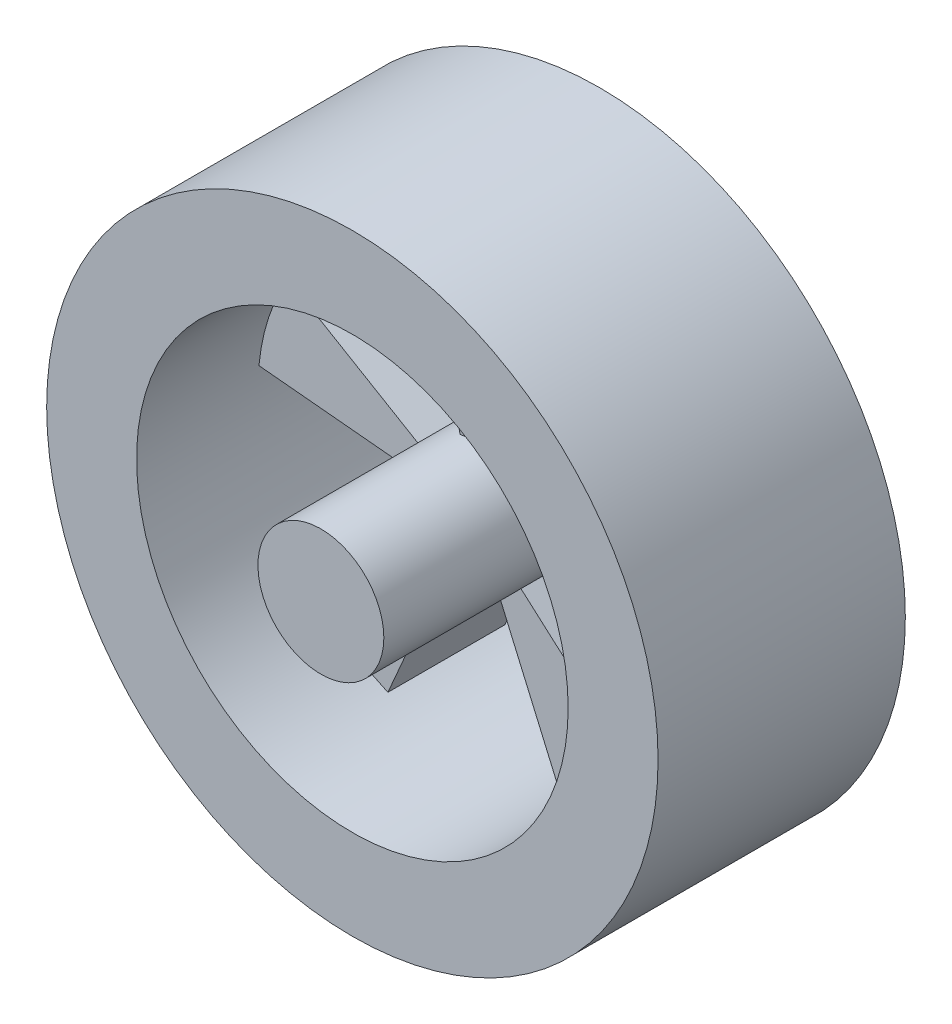
ISO-10303-21;
HEADER;
FILE_DESCRIPTION(('STEP AP214'),'2;1');
FILE_NAME('part.step','',(''),(''),'','','');
FILE_SCHEMA(('AUTOMOTIVE_DESIGN { 1 0 10303 214 1 1 1 1 }'));
ENDSEC;
DATA;
#1=APPLICATION_CONTEXT('core data for automotive mechanical design processes');
#2=APPLICATION_PROTOCOL_DEFINITION('international standard','automotive_design',2000,#1);
#3=PRODUCT_CONTEXT('',#1,'mechanical');
#4=PRODUCT('Part','Part','',(#3));
#5=PRODUCT_RELATED_PRODUCT_CATEGORY('part','',(#4));
#6=PRODUCT_DEFINITION_FORMATION('','',#4);
#7=PRODUCT_DEFINITION_CONTEXT('part definition',#1,'design');
#8=PRODUCT_DEFINITION('design','',#6,#7);
#9=PRODUCT_DEFINITION_SHAPE('','',#8);
#10=(LENGTH_UNIT() NAMED_UNIT(*) SI_UNIT(.MILLI.,.METRE.));
#11=(NAMED_UNIT(*) PLANE_ANGLE_UNIT() SI_UNIT($,.RADIAN.));
#12=(NAMED_UNIT(*) SI_UNIT($,.STERADIAN.) SOLID_ANGLE_UNIT());
#13=UNCERTAINTY_MEASURE_WITH_UNIT(LENGTH_MEASURE(1.E-05),#10,'distance_accuracy_value','');
#14=(GEOMETRIC_REPRESENTATION_CONTEXT(3) GLOBAL_UNCERTAINTY_ASSIGNED_CONTEXT((#13)) GLOBAL_UNIT_ASSIGNED_CONTEXT((#10,
#11,#12)) REPRESENTATION_CONTEXT('',''));
#15=CARTESIAN_POINT('',(0.,0.,0.));
#16=DIRECTION('',(0.,0.,1.));
#17=DIRECTION('',(1.,0.,0.));
#18=AXIS2_PLACEMENT_3D('',#15,#16,#17);
#19=CARTESIAN_POINT('',(0.,0.,30.));
#20=DIRECTION('',(0.,0.,-1.));
#21=DIRECTION('',(-1.,0.,0.));
#22=AXIS2_PLACEMENT_3D('',#19,#20,#21);
#23=CYLINDRICAL_SURFACE('',#22,7.);
#24=CARTESIAN_POINT('',(0.,0.,30.));
#25=DIRECTION('',(0.,0.,1.));
#26=DIRECTION('',(1.,0.,0.));
#27=AXIS2_PLACEMENT_3D('',#24,#25,#26);
#28=CIRCLE('',#27,7.);
#29=CARTESIAN_POINT('',(7.,0.,30.));
#30=VERTEX_POINT('',#29);
#31=EDGE_CURVE('E409',#30,#30,#28,.T.);
#32=ORIENTED_EDGE('',*,*,#31,.F.);
#33=EDGE_LOOP('',(#32));
#34=FACE_BOUND('',#33,.T.);
#35=DIRECTION('',(0.,0.,-1.));
#36=VECTOR('',#35,1.);
#37=CARTESIAN_POINT('',(-5.2469051071513,-4.63357171052198,30.));
#38=LINE('',#37,#36);
#39=CARTESIAN_POINT('',(-5.2469051071513,-4.63357171052198,13.));
#40=VERTEX_POINT('',#39);
#41=CARTESIAN_POINT('',(-5.2469051071513,-4.63357171052198,0.));
#42=VERTEX_POINT('',#41);
#43=EDGE_CURVE('E140',#40,#42,#38,.T.);
#44=ORIENTED_EDGE('',*,*,#43,.F.);
#45=CARTESIAN_POINT('',(0.,0.,13.));
#46=DIRECTION('',(0.,0.,1.));
#47=DIRECTION('',(1.,0.,0.));
#48=AXIS2_PLACEMENT_3D('',#45,#46,#47);
#49=CIRCLE('',#48,7.);
#50=CARTESIAN_POINT('',(-2.78540572303047,-6.4219556957448,13.));
#51=VERTEX_POINT('',#50);
#52=EDGE_CURVE('E135',#40,#51,#49,.T.);
#53=ORIENTED_EDGE('',*,*,#52,.T.);
#54=DIRECTION('',(0.,0.,-1.));
#55=VECTOR('',#54,1.);
#56=CARTESIAN_POINT('',(-2.78540572303047,-6.4219556957448,30.));
#57=LINE('',#56,#55);
#58=CARTESIAN_POINT('',(-2.78540572303047,-6.4219556957448,0.));
#59=VERTEX_POINT('',#58);
#60=EDGE_CURVE('E267',#59,#51,#57,.F.);
#61=ORIENTED_EDGE('',*,*,#60,.F.);
#62=CARTESIAN_POINT('',(0.,0.,0.));
#63=DIRECTION('',(0.,0.,1.));
#64=DIRECTION('',(1.,0.,0.));
#65=AXIS2_PLACEMENT_3D('',#62,#63,#64);
#66=CIRCLE('',#65,7.);
#67=CARTESIAN_POINT('',(2.78540572303037,-6.42195569574484,0.));
#68=VERTEX_POINT('',#67);
#69=EDGE_CURVE('E418',#59,#68,#66,.T.);
#70=ORIENTED_EDGE('',*,*,#69,.T.);
#71=DIRECTION('',(0.,0.,-1.));
#72=VECTOR('',#71,1.);
#73=CARTESIAN_POINT('',(2.78540572303037,-6.42195569574484,30.));
#74=LINE('',#73,#72);
#75=CARTESIAN_POINT('',(2.78540572303037,-6.42195569574484,13.));
#76=VERTEX_POINT('',#75);
#77=EDGE_CURVE('E330',#76,#68,#74,.T.);
#78=ORIENTED_EDGE('',*,*,#77,.F.);
#79=CARTESIAN_POINT('',(0.,0.,13.));
#80=DIRECTION('',(0.,0.,1.));
#81=DIRECTION('',(1.,0.,0.));
#82=AXIS2_PLACEMENT_3D('',#79,#80,#81);
#83=CIRCLE('',#82,7.);
#84=CARTESIAN_POINT('',(5.24690510715123,-4.63357171052206,13.));
#85=VERTEX_POINT('',#84);
#86=EDGE_CURVE('E334',#76,#85,#83,.T.);
#87=ORIENTED_EDGE('',*,*,#86,.T.);
#88=DIRECTION('',(0.,0.,-1.));
#89=VECTOR('',#88,1.);
#90=CARTESIAN_POINT('',(5.24690510715123,-4.63357171052206,30.));
#91=LINE('',#90,#89);
#92=CARTESIAN_POINT('',(5.24690510715123,-4.63357171052206,0.));
#93=VERTEX_POINT('',#92);
#94=EDGE_CURVE('E326',#93,#85,#91,.F.);
#95=ORIENTED_EDGE('',*,*,#94,.F.);
#96=CARTESIAN_POINT('',(6.96838051644253,0.664584816305722,0.));
#97=VERTEX_POINT('',#96);
#98=EDGE_CURVE('E493',#93,#97,#66,.T.);
#99=ORIENTED_EDGE('',*,*,#98,.T.);
#100=DIRECTION('',(0.,0.,-1.));
#101=VECTOR('',#100,1.);
#102=CARTESIAN_POINT('',(6.96838051644253,0.664584816305722,30.));
#103=LINE('',#102,#101);
#104=CARTESIAN_POINT('',(6.96838051644253,0.664584816305722,13.));
#105=VERTEX_POINT('',#104);
#106=EDGE_CURVE('E371',#105,#97,#103,.T.);
#107=ORIENTED_EDGE('',*,*,#106,.F.);
#108=CARTESIAN_POINT('',(0.,0.,13.));
#109=DIRECTION('',(0.,0.,1.));
#110=DIRECTION('',(1.,0.,0.));
#111=AXIS2_PLACEMENT_3D('',#108,#109,#110);
#112=CIRCLE('',#111,7.);
#113=CARTESIAN_POINT('',(6.02817141499531,3.55825088933221,13.));
#114=VERTEX_POINT('',#113);
#115=EDGE_CURVE('E375',#105,#114,#112,.T.);
#116=ORIENTED_EDGE('',*,*,#115,.T.);
#117=DIRECTION('',(0.,0.,-1.));
#118=VECTOR('',#117,1.);
#119=CARTESIAN_POINT('',(6.02817141499531,3.55825088933221,30.));
#120=LINE('',#119,#118);
#121=CARTESIAN_POINT('',(6.02817141499531,3.55825088933221,0.));
#122=VERTEX_POINT('',#121);
#123=EDGE_CURVE('E367',#122,#114,#120,.F.);
#124=ORIENTED_EDGE('',*,*,#123,.F.);
#125=CARTESIAN_POINT('',(1.52129028267362,6.83269170062888,0.));
#126=VERTEX_POINT('',#125);
#127=EDGE_CURVE('E408',#122,#126,#66,.T.);
#128=ORIENTED_EDGE('',*,*,#127,.T.);
#129=DIRECTION('',(0.,0.,-1.));
#130=VECTOR('',#129,1.);
#131=CARTESIAN_POINT('',(1.52129028267362,6.83269170062888,30.));
#132=LINE('',#131,#130);
#133=CARTESIAN_POINT('',(1.52129028267362,6.83269170062888,13.));
#134=VERTEX_POINT('',#133);
#135=EDGE_CURVE('E425',#126,#134,#132,.F.);
#136=ORIENTED_EDGE('',*,*,#135,.T.);
#137=CARTESIAN_POINT('',(0.,0.,13.));
#138=DIRECTION('',(0.,0.,1.));
#139=DIRECTION('',(1.,0.,0.));
#140=AXIS2_PLACEMENT_3D('',#137,#138,#139);
#141=CIRCLE('',#140,7.);
#142=CARTESIAN_POINT('',(-1.52129028267362,6.83269170062889,13.));
#143=VERTEX_POINT('',#142);
#144=EDGE_CURVE('E413',#143,#134,#141,.F.);
#145=ORIENTED_EDGE('',*,*,#144,.F.);
#146=DIRECTION('',(0.,0.,-1.));
#147=VECTOR('',#146,1.);
#148=CARTESIAN_POINT('',(-1.52129028267361,6.83269170062888,30.));
#149=LINE('',#148,#147);
#150=CARTESIAN_POINT('',(-1.52129028267362,6.83269170062888,0.));
#151=VERTEX_POINT('',#150);
#152=EDGE_CURVE('E422',#143,#151,#149,.T.);
#153=ORIENTED_EDGE('',*,*,#152,.T.);
#154=CARTESIAN_POINT('',(-6.02817141499526,3.5582508893323,0.));
#155=VERTEX_POINT('',#154);
#156=EDGE_CURVE('E414',#151,#155,#66,.T.);
#157=ORIENTED_EDGE('',*,*,#156,.T.);
#158=DIRECTION('',(0.,0.,-1.));
#159=VECTOR('',#158,1.);
#160=CARTESIAN_POINT('',(-6.02817141499526,3.5582508893323,30.));
#161=LINE('',#160,#159);
#162=CARTESIAN_POINT('',(-6.02817141499526,3.5582508893323,13.));
#163=VERTEX_POINT('',#162);
#164=EDGE_CURVE('E12',#163,#155,#161,.T.);
#165=ORIENTED_EDGE('',*,*,#164,.F.);
#166=CARTESIAN_POINT('',(0.,0.,13.));
#167=DIRECTION('',(0.,0.,1.));
#168=DIRECTION('',(1.,0.,0.));
#169=AXIS2_PLACEMENT_3D('',#166,#167,#168);
#170=CIRCLE('',#169,7.);
#171=CARTESIAN_POINT('',(-6.96838051644252,0.664584816305829,13.));
#172=VERTEX_POINT('',#171);
#173=EDGE_CURVE('E473',#163,#172,#170,.T.);
#174=ORIENTED_EDGE('',*,*,#173,.T.);
#175=DIRECTION('',(0.,0.,-1.));
#176=VECTOR('',#175,1.);
#177=CARTESIAN_POINT('',(-6.96838051644252,0.664584816305829,30.));
#178=LINE('',#177,#176);
#179=CARTESIAN_POINT('',(-6.96838051644252,0.664584816305829,0.));
#180=VERTEX_POINT('',#179);
#181=EDGE_CURVE('E128',#180,#172,#178,.F.);
#182=ORIENTED_EDGE('',*,*,#181,.F.);
#183=EDGE_CURVE('E417',#180,#42,#66,.T.);
#184=ORIENTED_EDGE('',*,*,#183,.T.);
#185=EDGE_LOOP('',(#44,#53,#61,#70,#78,#87,#95,#99,#107,#116,#124,#128,#136,#145,#153,#157,#165,
#174,#182,#184));
#186=FACE_BOUND('',#185,.T.);
#187=ADVANCED_FACE('F119',(#34,#186),#23,.T.);
#188=CARTESIAN_POINT('',(0.,0.,13.));
#189=DIRECTION('',(-0.976098814375555,0.217327183239089,0.));
#190=DIRECTION('',(-0.217327183239089,-0.976098814375555,0.));
#191=AXIS2_PLACEMENT_3D('',#188,#189,#190);
#192=PLANE('',#191);
#193=ORIENTED_EDGE('',*,*,#135,.F.);
#194=DIRECTION('',(0.217327183239089,0.976098814375555,0.));
#195=VECTOR('',#194,1.);
#196=CARTESIAN_POINT('',(0.,0.,0.));
#197=LINE('',#196,#195);
#198=CARTESIAN_POINT('',(5.21585239773813,23.4263715450133,0.));
#199=VERTEX_POINT('',#198);
#200=EDGE_CURVE('E428',#126,#199,#197,.T.);
#201=ORIENTED_EDGE('',*,*,#200,.T.);
#202=DIRECTION('',(0.,0.,-1.));
#203=VECTOR('',#202,1.);
#204=CARTESIAN_POINT('',(5.21585239773813,23.4263715450133,13.));
#205=LINE('',#204,#203);
#206=CARTESIAN_POINT('',(5.21585239773813,23.4263715450133,13.));
#207=VERTEX_POINT('',#206);
#208=EDGE_CURVE('E453',#207,#199,#205,.T.);
#209=ORIENTED_EDGE('',*,*,#208,.F.);
#210=DIRECTION('',(0.217327183239089,0.976098814375555,0.));
#211=VECTOR('',#210,1.);
#212=CARTESIAN_POINT('',(0.,0.,13.));
#213=LINE('',#212,#211);
#214=EDGE_CURVE('E429',#134,#207,#213,.T.);
#215=ORIENTED_EDGE('',*,*,#214,.F.);
#216=EDGE_LOOP('',(#193,#201,#209,#215));
#217=FACE_BOUND('',#216,.T.);
#218=ADVANCED_FACE('F525',(#217),#192,.F.);
#219=CARTESIAN_POINT('',(0.,0.,13.));
#220=DIRECTION('',(0.976098814375555,0.217327183239088,0.));
#221=DIRECTION('',(-0.217327183239088,0.976098814375555,0.));
#222=AXIS2_PLACEMENT_3D('',#219,#220,#221);
#223=PLANE('',#222);
#224=ORIENTED_EDGE('',*,*,#152,.F.);
#225=DIRECTION('',(0.217327183239088,-0.976098814375555,0.));
#226=VECTOR('',#225,1.);
#227=CARTESIAN_POINT('',(0.,0.,13.));
#228=LINE('',#227,#226);
#229=CARTESIAN_POINT('',(-5.21585239773811,23.4263715450133,13.));
#230=VERTEX_POINT('',#229);
#231=EDGE_CURVE('E437',#230,#143,#228,.T.);
#232=ORIENTED_EDGE('',*,*,#231,.F.);
#233=DIRECTION('',(0.,0.,-1.));
#234=VECTOR('',#233,1.);
#235=CARTESIAN_POINT('',(-5.21585239773811,23.4263715450133,13.));
#236=LINE('',#235,#234);
#237=CARTESIAN_POINT('',(-5.21585239773811,23.4263715450133,0.));
#238=VERTEX_POINT('',#237);
#239=EDGE_CURVE('E441',#230,#238,#236,.T.);
#240=ORIENTED_EDGE('',*,*,#239,.T.);
#241=DIRECTION('',(0.217327183239088,-0.976098814375555,0.));
#242=VECTOR('',#241,1.);
#243=CARTESIAN_POINT('',(0.,0.,0.));
#244=LINE('',#243,#242);
#245=EDGE_CURVE('E433',#238,#151,#244,.T.);
#246=ORIENTED_EDGE('',*,*,#245,.T.);
#247=EDGE_LOOP('',(#224,#232,#240,#246));
#248=FACE_BOUND('',#247,.T.);
#249=ADVANCED_FACE('F531',(#248),#223,.F.);
#250=CARTESIAN_POINT('',(0.,0.,-1.));
#251=DIRECTION('',(0.,0.,1.));
#252=DIRECTION('',(1.,0.,0.));
#253=AXIS2_PLACEMENT_3D('',#250,#251,#252);
#254=CYLINDRICAL_SURFACE('',#253,24.);
#255=DIRECTION('',(0.,0.,-1.));
#256=VECTOR('',#255,1.);
#257=CARTESIAN_POINT('',(-9.54996247896161,-22.0181338139822,13.));
#258=LINE('',#257,#256);
#259=CARTESIAN_POINT('',(-9.5499624789616,-22.0181338139822,13.));
#260=VERTEX_POINT('',#259);
#261=CARTESIAN_POINT('',(-9.54996247896161,-22.0181338139822,0.));
#262=VERTEX_POINT('',#261);
#263=EDGE_CURVE('E268',#260,#262,#258,.T.);
#264=ORIENTED_EDGE('',*,*,#263,.F.);
#265=CARTESIAN_POINT('',(0.,0.,13.));
#266=DIRECTION('',(0.,0.,1.));
#267=DIRECTION('',(1.,0.,0.));
#268=AXIS2_PLACEMENT_3D('',#265,#266,#267);
#269=CIRCLE('',#268,24.);
#270=CARTESIAN_POINT('',(-17.9893889388045,-15.8865315789325,13.));
#271=VERTEX_POINT('',#270);
#272=EDGE_CURVE('E262',#271,#260,#269,.T.);
#273=ORIENTED_EDGE('',*,*,#272,.F.);
#274=DIRECTION('',(0.,0.,-1.));
#275=VECTOR('',#274,1.);
#276=CARTESIAN_POINT('',(-17.9893889388045,-15.8865315789325,13.));
#277=LINE('',#276,#275);
#278=CARTESIAN_POINT('',(-17.9893889388045,-15.8865315789325,0.));
#279=VERTEX_POINT('',#278);
#280=EDGE_CURVE('E255',#271,#279,#277,.T.);
#281=ORIENTED_EDGE('',*,*,#280,.T.);
#282=CARTESIAN_POINT('',(0.,0.,0.));
#283=DIRECTION('',(0.,0.,1.));
#284=DIRECTION('',(1.,0.,0.));
#285=AXIS2_PLACEMENT_3D('',#282,#283,#284);
#286=CIRCLE('',#285,24.);
#287=EDGE_CURVE('E259',#279,#262,#286,.T.);
#288=ORIENTED_EDGE('',*,*,#287,.T.);
#289=EDGE_LOOP('',(#264,#273,#281,#288));
#290=FACE_BOUND('',#289,.T.);
#291=DIRECTION('',(0.,0.,-1.));
#292=VECTOR('',#291,1.);
#293=CARTESIAN_POINT('',(17.9893889388042,-15.8865315789328,13.));
#294=LINE('',#293,#292);
#295=CARTESIAN_POINT('',(17.9893889388042,-15.8865315789328,13.));
#296=VERTEX_POINT('',#295);
#297=CARTESIAN_POINT('',(17.9893889388042,-15.8865315789328,0.));
#298=VERTEX_POINT('',#297);
#299=EDGE_CURVE('E310',#296,#298,#294,.T.);
#300=ORIENTED_EDGE('',*,*,#299,.F.);
#301=CARTESIAN_POINT('',(0.,0.,13.));
#302=DIRECTION('',(0.,0.,1.));
#303=DIRECTION('',(1.,0.,0.));
#304=AXIS2_PLACEMENT_3D('',#301,#302,#303);
#305=CIRCLE('',#304,24.);
#306=CARTESIAN_POINT('',(9.54996247896128,-22.0181338139823,13.));
#307=VERTEX_POINT('',#306);
#308=EDGE_CURVE('E301',#307,#296,#305,.T.);
#309=ORIENTED_EDGE('',*,*,#308,.F.);
#310=DIRECTION('',(0.,0.,-1.));
#311=VECTOR('',#310,1.);
#312=CARTESIAN_POINT('',(9.54996247896128,-22.0181338139823,13.));
#313=LINE('',#312,#311);
#314=CARTESIAN_POINT('',(9.54996247896128,-22.0181338139823,0.));
#315=VERTEX_POINT('',#314);
#316=EDGE_CURVE('E323',#307,#315,#313,.T.);
#317=ORIENTED_EDGE('',*,*,#316,.T.);
#318=CARTESIAN_POINT('',(0.,0.,0.));
#319=DIRECTION('',(0.,0.,1.));
#320=DIRECTION('',(1.,0.,0.));
#321=AXIS2_PLACEMENT_3D('',#318,#319,#320);
#322=CIRCLE('',#321,24.);
#323=EDGE_CURVE('E314',#315,#298,#322,.T.);
#324=ORIENTED_EDGE('',*,*,#323,.T.);
#325=EDGE_LOOP('',(#300,#309,#317,#324));
#326=FACE_BOUND('',#325,.T.);
#327=DIRECTION('',(0.,0.,-1.));
#328=VECTOR('',#327,1.);
#329=CARTESIAN_POINT('',(20.6680162799839,12.1997173348533,13.));
#330=LINE('',#329,#328);
#331=CARTESIAN_POINT('',(20.6680162799839,12.1997173348533,13.));
#332=VERTEX_POINT('',#331);
#333=CARTESIAN_POINT('',(20.6680162799839,12.1997173348533,0.));
#334=VERTEX_POINT('',#333);
#335=EDGE_CURVE('E351',#332,#334,#330,.T.);
#336=ORIENTED_EDGE('',*,*,#335,.F.);
#337=CARTESIAN_POINT('',(0.,0.,13.));
#338=DIRECTION('',(0.,0.,1.));
#339=DIRECTION('',(1.,0.,0.));
#340=AXIS2_PLACEMENT_3D('',#337,#338,#339);
#341=CIRCLE('',#340,24.);
#342=CARTESIAN_POINT('',(23.8915903420887,2.27857651304819,13.));
#343=VERTEX_POINT('',#342);
#344=EDGE_CURVE('E342',#343,#332,#341,.T.);
#345=ORIENTED_EDGE('',*,*,#344,.F.);
#346=DIRECTION('',(0.,0.,-1.));
#347=VECTOR('',#346,1.);
#348=CARTESIAN_POINT('',(23.8915903420887,2.27857651304819,13.));
#349=LINE('',#348,#347);
#350=CARTESIAN_POINT('',(23.8915903420887,2.27857651304819,0.));
#351=VERTEX_POINT('',#350);
#352=EDGE_CURVE('E364',#343,#351,#349,.T.);
#353=ORIENTED_EDGE('',*,*,#352,.T.);
#354=CARTESIAN_POINT('',(0.,0.,0.));
#355=DIRECTION('',(0.,0.,1.));
#356=DIRECTION('',(1.,0.,0.));
#357=AXIS2_PLACEMENT_3D('',#354,#355,#356);
#358=CIRCLE('',#357,24.);
#359=EDGE_CURVE('E355',#351,#334,#358,.T.);
#360=ORIENTED_EDGE('',*,*,#359,.T.);
#361=EDGE_LOOP('',(#336,#345,#353,#360));
#362=FACE_BOUND('',#361,.T.);
#363=DIRECTION('',(0.,0.,-1.));
#364=VECTOR('',#363,1.);
#365=CARTESIAN_POINT('',(-23.8915903420887,2.27857651304855,13.));
#366=LINE('',#365,#364);
#367=CARTESIAN_POINT('',(-23.8915903420887,2.27857651304855,13.));
#368=VERTEX_POINT('',#367);
#369=CARTESIAN_POINT('',(-23.8915903420887,2.27857651304855,0.));
#370=VERTEX_POINT('',#369);
#371=EDGE_CURVE('E392',#368,#370,#366,.T.);
#372=ORIENTED_EDGE('',*,*,#371,.F.);
#373=CARTESIAN_POINT('',(0.,0.,13.));
#374=DIRECTION('',(0.,0.,1.));
#375=DIRECTION('',(1.,0.,0.));
#376=AXIS2_PLACEMENT_3D('',#373,#374,#375);
#377=CIRCLE('',#376,24.);
#378=CARTESIAN_POINT('',(-20.6680162799837,12.1997173348536,13.));
#379=VERTEX_POINT('',#378);
#380=EDGE_CURVE('E383',#379,#368,#377,.T.);
#381=ORIENTED_EDGE('',*,*,#380,.F.);
#382=DIRECTION('',(0.,0.,-1.));
#383=VECTOR('',#382,1.);
#384=CARTESIAN_POINT('',(-20.6680162799837,12.1997173348536,13.));
#385=LINE('',#384,#383);
#386=CARTESIAN_POINT('',(-20.6680162799837,12.1997173348536,0.));
#387=VERTEX_POINT('',#386);
#388=EDGE_CURVE('E405',#379,#387,#385,.T.);
#389=ORIENTED_EDGE('',*,*,#388,.T.);
#390=CARTESIAN_POINT('',(0.,0.,0.));
#391=DIRECTION('',(0.,0.,1.));
#392=DIRECTION('',(1.,0.,0.));
#393=AXIS2_PLACEMENT_3D('',#390,#391,#392);
#394=CIRCLE('',#393,24.);
#395=EDGE_CURVE('E396',#387,#370,#394,.T.);
#396=ORIENTED_EDGE('',*,*,#395,.T.);
#397=EDGE_LOOP('',(#372,#381,#389,#396));
#398=FACE_BOUND('',#397,.T.);
#399=ORIENTED_EDGE('',*,*,#239,.F.);
#400=CARTESIAN_POINT('',(0.,0.,13.));
#401=DIRECTION('',(0.,0.,1.));
#402=DIRECTION('',(1.,0.,0.));
#403=AXIS2_PLACEMENT_3D('',#400,#401,#402);
#404=CIRCLE('',#403,24.);
#405=EDGE_CURVE('E432',#207,#230,#404,.T.);
#406=ORIENTED_EDGE('',*,*,#405,.F.);
#407=ORIENTED_EDGE('',*,*,#208,.T.);
#408=CARTESIAN_POINT('',(0.,0.,0.));
#409=DIRECTION('',(0.,0.,1.));
#410=DIRECTION('',(1.,0.,0.));
#411=AXIS2_PLACEMENT_3D('',#408,#409,#410);
#412=CIRCLE('',#411,24.);
#413=EDGE_CURVE('E444',#199,#238,#412,.T.);
#414=ORIENTED_EDGE('',*,*,#413,.T.);
#415=EDGE_LOOP('',(#399,#406,#407,#414));
#416=FACE_BOUND('',#415,.T.);
#417=CARTESIAN_POINT('',(0.,0.,-1.));
#418=DIRECTION('',(0.,0.,1.));
#419=DIRECTION('',(1.,0.,0.));
#420=AXIS2_PLACEMENT_3D('',#417,#418,#419);
#421=CIRCLE('',#420,24.);
#422=CARTESIAN_POINT('',(24.,0.,-1.));
#423=VERTEX_POINT('',#422);
#424=EDGE_CURVE('E465',#423,#423,#421,.T.);
#425=ORIENTED_EDGE('',*,*,#424,.F.);
#426=EDGE_LOOP('',(#425));
#427=FACE_BOUND('',#426,.T.);
#428=CARTESIAN_POINT('',(0.,0.,26.5));
#429=DIRECTION('',(0.,0.,1.));
#430=DIRECTION('',(1.,0.,0.));
#431=AXIS2_PLACEMENT_3D('',#428,#429,#430);
#432=CIRCLE('',#431,24.);
#433=CARTESIAN_POINT('',(24.,0.,26.5));
#434=VERTEX_POINT('',#433);
#435=EDGE_CURVE('E457',#434,#434,#432,.T.);
#436=ORIENTED_EDGE('',*,*,#435,.T.);
#437=EDGE_LOOP('',(#436));
#438=FACE_BOUND('',#437,.T.);
#439=ADVANCED_FACE('F121',(#290,#326,#362,#398,#416,#427,#438),#254,.F.);
#440=CARTESIAN_POINT('',(0.,0.,-1.));
#441=DIRECTION('',(0.,0.,1.));
#442=DIRECTION('',(1.,0.,0.));
#443=AXIS2_PLACEMENT_3D('',#440,#441,#442);
#444=CYLINDRICAL_SURFACE('',#443,34.);
#445=CARTESIAN_POINT('',(0.,0.,-1.));
#446=DIRECTION('',(0.,0.,1.));
#447=DIRECTION('',(1.,0.,0.));
#448=AXIS2_PLACEMENT_3D('',#445,#446,#447);
#449=CIRCLE('',#448,34.);
#450=CARTESIAN_POINT('',(34.,0.,-1.));
#451=VERTEX_POINT('',#450);
#452=EDGE_CURVE('E469',#451,#451,#449,.T.);
#453=ORIENTED_EDGE('',*,*,#452,.T.);
#454=EDGE_LOOP('',(#453));
#455=FACE_BOUND('',#454,.T.);
#456=CARTESIAN_POINT('',(0.,0.,26.5));
#457=DIRECTION('',(0.,0.,1.));
#458=DIRECTION('',(1.,0.,0.));
#459=AXIS2_PLACEMENT_3D('',#456,#457,#458);
#460=CIRCLE('',#459,34.);
#461=CARTESIAN_POINT('',(34.,0.,26.5));
#462=VERTEX_POINT('',#461);
#463=EDGE_CURVE('E461',#462,#462,#460,.T.);
#464=ORIENTED_EDGE('',*,*,#463,.F.);
#465=EDGE_LOOP('',(#464));
#466=FACE_BOUND('',#465,.T.);
#467=ADVANCED_FACE('F554',(#455,#466),#444,.T.);
#468=CARTESIAN_POINT('',(0.,0.,-1.));
#469=DIRECTION('',(0.,0.,1.));
#470=DIRECTION('',(1.,0.,0.));
#471=AXIS2_PLACEMENT_3D('',#468,#469,#470);
#472=PLANE('',#471);
#473=ORIENTED_EDGE('',*,*,#424,.T.);
#474=EDGE_LOOP('',(#473));
#475=FACE_BOUND('',#474,.T.);
#476=ORIENTED_EDGE('',*,*,#452,.F.);
#477=EDGE_LOOP('',(#476));
#478=FACE_BOUND('',#477,.T.);
#479=ADVANCED_FACE('F551',(#475,#478),#472,.F.);
#480=CARTESIAN_POINT('',(0.,0.,26.5));
#481=DIRECTION('',(0.,0.,1.));
#482=DIRECTION('',(1.,0.,0.));
#483=AXIS2_PLACEMENT_3D('',#480,#481,#482);
#484=PLANE('',#483);
#485=ORIENTED_EDGE('',*,*,#435,.F.);
#486=EDGE_LOOP('',(#485));
#487=FACE_BOUND('',#486,.T.);
#488=ORIENTED_EDGE('',*,*,#463,.T.);
#489=EDGE_LOOP('',(#488));
#490=FACE_BOUND('',#489,.T.);
#491=ADVANCED_FACE('F542',(#487,#490),#484,.T.);
#492=CARTESIAN_POINT('',(0.,0.,13.));
#493=DIRECTION('',(0.,0.,1.));
#494=DIRECTION('',(1.,0.,0.));
#495=AXIS2_PLACEMENT_3D('',#492,#493,#494);
#496=PLANE('',#495);
#497=ORIENTED_EDGE('',*,*,#231,.T.);
#498=ORIENTED_EDGE('',*,*,#144,.T.);
#499=ORIENTED_EDGE('',*,*,#214,.T.);
#500=ORIENTED_EDGE('',*,*,#405,.T.);
#501=EDGE_LOOP('',(#497,#498,#499,#500));
#502=FACE_BOUND('',#501,.T.);
#503=ADVANCED_FACE('F539',(#502),#496,.T.);
#504=CARTESIAN_POINT('',(0.,0.,0.));
#505=DIRECTION('',(0.,0.,1.));
#506=DIRECTION('',(1.,0.,0.));
#507=AXIS2_PLACEMENT_3D('',#504,#505,#506);
#508=PLANE('',#507);
#509=ORIENTED_EDGE('',*,*,#69,.F.);
#510=DIRECTION('',(0.397915103290067,0.917422242249258,0.));
#511=VECTOR('',#510,1.);
#512=CARTESIAN_POINT('',(0.,0.,0.));
#513=LINE('',#512,#511);
#514=EDGE_CURVE('E279',#262,#59,#513,.T.);
#515=ORIENTED_EDGE('',*,*,#514,.F.);
#516=ORIENTED_EDGE('',*,*,#287,.F.);
#517=DIRECTION('',(-0.749557872450186,-0.661938815788854,0.));
#518=VECTOR('',#517,1.);
#519=CARTESIAN_POINT('',(0.,0.,0.));
#520=LINE('',#519,#518);
#521=EDGE_CURVE('E271',#42,#279,#520,.T.);
#522=ORIENTED_EDGE('',*,*,#521,.F.);
#523=ORIENTED_EDGE('',*,*,#183,.F.);
#524=DIRECTION('',(0.99548293092036,-0.0949406880436898,0.));
#525=VECTOR('',#524,1.);
#526=CARTESIAN_POINT('',(0.,0.,0.));
#527=LINE('',#526,#525);
#528=EDGE_CURVE('E384',#370,#180,#527,.T.);
#529=ORIENTED_EDGE('',*,*,#528,.F.);
#530=ORIENTED_EDGE('',*,*,#395,.F.);
#531=DIRECTION('',(-0.861167344999323,0.5083215556189,0.));
#532=VECTOR('',#531,1.);
#533=CARTESIAN_POINT('',(0.,0.,0.));
#534=LINE('',#533,#532);
#535=EDGE_CURVE('E378',#155,#387,#534,.T.);
#536=ORIENTED_EDGE('',*,*,#535,.F.);
#537=ORIENTED_EDGE('',*,*,#156,.F.);
#538=ORIENTED_EDGE('',*,*,#245,.F.);
#539=ORIENTED_EDGE('',*,*,#413,.F.);
#540=ORIENTED_EDGE('',*,*,#200,.F.);
#541=ORIENTED_EDGE('',*,*,#127,.F.);
#542=DIRECTION('',(-0.86116734499933,-0.508321555618887,0.));
#543=VECTOR('',#542,1.);
#544=CARTESIAN_POINT('',(0.,0.,0.));
#545=LINE('',#544,#543);
#546=EDGE_CURVE('E343',#334,#122,#545,.T.);
#547=ORIENTED_EDGE('',*,*,#546,.F.);
#548=ORIENTED_EDGE('',*,*,#359,.F.);
#549=DIRECTION('',(0.995482930920362,0.0949406880436746,0.));
#550=VECTOR('',#549,1.);
#551=CARTESIAN_POINT('',(0.,0.,0.));
#552=LINE('',#551,#550);
#553=EDGE_CURVE('E337',#97,#351,#552,.T.);
#554=ORIENTED_EDGE('',*,*,#553,.F.);
#555=ORIENTED_EDGE('',*,*,#98,.F.);
#556=DIRECTION('',(-0.749557872450176,0.661938815788866,0.));
#557=VECTOR('',#556,1.);
#558=CARTESIAN_POINT('',(0.,0.,0.));
#559=LINE('',#558,#557);
#560=EDGE_CURVE('E302',#298,#93,#559,.T.);
#561=ORIENTED_EDGE('',*,*,#560,.F.);
#562=ORIENTED_EDGE('',*,*,#323,.F.);
#563=DIRECTION('',(0.397915103290053,-0.917422242249263,0.));
#564=VECTOR('',#563,1.);
#565=CARTESIAN_POINT('',(0.,0.,0.));
#566=LINE('',#565,#564);
#567=EDGE_CURVE('E296',#68,#315,#566,.T.);
#568=ORIENTED_EDGE('',*,*,#567,.F.);
#569=EDGE_LOOP('',(#509,#515,#516,#522,#523,#529,#530,#536,#537,#538,#539,#540,#541,#547,#548,
#554,#555,#561,#562,#568));
#570=FACE_BOUND('',#569,.T.);
#571=ADVANCED_FACE('F277',(#570),#508,.F.);
#572=CARTESIAN_POINT('',(0.,0.,30.));
#573=DIRECTION('',(0.,0.,1.));
#574=DIRECTION('',(1.,0.,0.));
#575=AXIS2_PLACEMENT_3D('',#572,#573,#574);
#576=PLANE('',#575);
#577=ORIENTED_EDGE('',*,*,#31,.T.);
#578=EDGE_LOOP('',(#577));
#579=FACE_BOUND('',#578,.T.);
#580=ADVANCED_FACE('F537',(#579),#576,.T.);
#581=CARTESIAN_POINT('',(0.,0.,13.));
#582=DIRECTION('',(-0.5083215556189,-0.861167344999322,0.));
#583=DIRECTION('',(0.861167344999322,-0.5083215556189,0.));
#584=AXIS2_PLACEMENT_3D('',#581,#582,#583);
#585=PLANE('',#584);
#586=DIRECTION('',(-0.861167344999323,0.5083215556189,0.));
#587=VECTOR('',#586,1.);
#588=CARTESIAN_POINT('',(0.,0.,13.));
#589=LINE('',#588,#587);
#590=EDGE_CURVE('E379',#163,#379,#589,.T.);
#591=ORIENTED_EDGE('',*,*,#590,.F.);
#592=ORIENTED_EDGE('',*,*,#164,.T.);
#593=ORIENTED_EDGE('',*,*,#535,.T.);
#594=ORIENTED_EDGE('',*,*,#388,.F.);
#595=EDGE_LOOP('',(#591,#592,#593,#594));
#596=FACE_BOUND('',#595,.T.);
#597=ADVANCED_FACE('F615',(#596),#585,.F.);
#598=CARTESIAN_POINT('',(0.,0.,13.));
#599=DIRECTION('',(0.0949406880436898,0.99548293092036,0.));
#600=DIRECTION('',(-0.99548293092036,0.0949406880436898,0.));
#601=AXIS2_PLACEMENT_3D('',#598,#599,#600);
#602=PLANE('',#601);
#603=ORIENTED_EDGE('',*,*,#528,.T.);
#604=ORIENTED_EDGE('',*,*,#181,.T.);
#605=DIRECTION('',(0.99548293092036,-0.0949406880436898,0.));
#606=VECTOR('',#605,1.);
#607=CARTESIAN_POINT('',(0.,0.,13.));
#608=LINE('',#607,#606);
#609=EDGE_CURVE('E388',#368,#172,#608,.T.);
#610=ORIENTED_EDGE('',*,*,#609,.F.);
#611=ORIENTED_EDGE('',*,*,#371,.T.);
#612=EDGE_LOOP('',(#603,#604,#610,#611));
#613=FACE_BOUND('',#612,.T.);
#614=ADVANCED_FACE('F480',(#613),#602,.F.);
#615=CARTESIAN_POINT('',(0.,0.,13.));
#616=DIRECTION('',(0.,0.,1.));
#617=DIRECTION('',(1.,0.,0.));
#618=AXIS2_PLACEMENT_3D('',#615,#616,#617);
#619=PLANE('',#618);
#620=ORIENTED_EDGE('',*,*,#173,.F.);
#621=ORIENTED_EDGE('',*,*,#590,.T.);
#622=ORIENTED_EDGE('',*,*,#380,.T.);
#623=ORIENTED_EDGE('',*,*,#609,.T.);
#624=EDGE_LOOP('',(#620,#621,#622,#623));
#625=FACE_BOUND('',#624,.T.);
#626=ADVANCED_FACE('F484',(#625),#619,.T.);
#627=CARTESIAN_POINT('',(0.,0.,13.));
#628=DIRECTION('',(0.,0.,1.));
#629=DIRECTION('',(1.,0.,0.));
#630=AXIS2_PLACEMENT_3D('',#627,#628,#629);
#631=PLANE('',#630);
#632=ORIENTED_EDGE('',*,*,#115,.F.);
#633=DIRECTION('',(0.995482930920362,0.0949406880436746,0.));
#634=VECTOR('',#633,1.);
#635=CARTESIAN_POINT('',(0.,0.,13.));
#636=LINE('',#635,#634);
#637=EDGE_CURVE('E338',#105,#343,#636,.T.);
#638=ORIENTED_EDGE('',*,*,#637,.T.);
#639=ORIENTED_EDGE('',*,*,#344,.T.);
#640=DIRECTION('',(-0.86116734499933,-0.508321555618887,0.));
#641=VECTOR('',#640,1.);
#642=CARTESIAN_POINT('',(0.,0.,13.));
#643=LINE('',#642,#641);
#644=EDGE_CURVE('E347',#332,#114,#643,.T.);
#645=ORIENTED_EDGE('',*,*,#644,.T.);
#646=EDGE_LOOP('',(#632,#638,#639,#645));
#647=FACE_BOUND('',#646,.T.);
#648=ADVANCED_FACE('F513',(#647),#631,.T.);
#649=CARTESIAN_POINT('',(0.,0.,13.));
#650=DIRECTION('',(-0.0949406880436746,0.995482930920362,0.));
#651=DIRECTION('',(-0.995482930920362,-0.0949406880436745,0.));
#652=AXIS2_PLACEMENT_3D('',#649,#650,#651);
#653=PLANE('',#652);
#654=ORIENTED_EDGE('',*,*,#637,.F.);
#655=ORIENTED_EDGE('',*,*,#106,.T.);
#656=ORIENTED_EDGE('',*,*,#553,.T.);
#657=ORIENTED_EDGE('',*,*,#352,.F.);
#658=EDGE_LOOP('',(#654,#655,#656,#657));
#659=FACE_BOUND('',#658,.T.);
#660=ADVANCED_FACE('F504',(#659),#653,.F.);
#661=CARTESIAN_POINT('',(0.,0.,13.));
#662=DIRECTION('',(0.508321555618887,-0.86116734499933,0.));
#663=DIRECTION('',(0.86116734499933,0.508321555618887,0.));
#664=AXIS2_PLACEMENT_3D('',#661,#662,#663);
#665=PLANE('',#664);
#666=ORIENTED_EDGE('',*,*,#546,.T.);
#667=ORIENTED_EDGE('',*,*,#123,.T.);
#668=ORIENTED_EDGE('',*,*,#644,.F.);
#669=ORIENTED_EDGE('',*,*,#335,.T.);
#670=EDGE_LOOP('',(#666,#667,#668,#669));
#671=FACE_BOUND('',#670,.T.);
#672=ADVANCED_FACE('F511',(#671),#665,.F.);
#673=CARTESIAN_POINT('',(0.,0.,13.));
#674=DIRECTION('',(0.,0.,1.));
#675=DIRECTION('',(1.,0.,0.));
#676=AXIS2_PLACEMENT_3D('',#673,#674,#675);
#677=PLANE('',#676);
#678=ORIENTED_EDGE('',*,*,#86,.F.);
#679=DIRECTION('',(0.397915103290053,-0.917422242249263,0.));
#680=VECTOR('',#679,1.);
#681=CARTESIAN_POINT('',(0.,0.,13.));
#682=LINE('',#681,#680);
#683=EDGE_CURVE('E297',#76,#307,#682,.T.);
#684=ORIENTED_EDGE('',*,*,#683,.T.);
#685=ORIENTED_EDGE('',*,*,#308,.T.);
#686=DIRECTION('',(-0.749557872450176,0.661938815788866,0.));
#687=VECTOR('',#686,1.);
#688=CARTESIAN_POINT('',(0.,0.,13.));
#689=LINE('',#688,#687);
#690=EDGE_CURVE('E306',#296,#85,#689,.T.);
#691=ORIENTED_EDGE('',*,*,#690,.T.);
#692=EDGE_LOOP('',(#678,#684,#685,#691));
#693=FACE_BOUND('',#692,.T.);
#694=ADVANCED_FACE('F641',(#693),#677,.T.);
#695=CARTESIAN_POINT('',(0.,0.,13.));
#696=DIRECTION('',(0.917422242249263,0.397915103290053,0.));
#697=DIRECTION('',(-0.397915103290053,0.917422242249263,0.));
#698=AXIS2_PLACEMENT_3D('',#695,#696,#697);
#699=PLANE('',#698);
#700=ORIENTED_EDGE('',*,*,#683,.F.);
#701=ORIENTED_EDGE('',*,*,#77,.T.);
#702=ORIENTED_EDGE('',*,*,#567,.T.);
#703=ORIENTED_EDGE('',*,*,#316,.F.);
#704=EDGE_LOOP('',(#700,#701,#702,#703));
#705=FACE_BOUND('',#704,.T.);
#706=ADVANCED_FACE('F646',(#705),#699,.F.);
#707=CARTESIAN_POINT('',(0.,0.,13.));
#708=DIRECTION('',(-0.661938815788865,-0.749557872450176,0.));
#709=DIRECTION('',(0.749557872450176,-0.661938815788866,0.));
#710=AXIS2_PLACEMENT_3D('',#707,#708,#709);
#711=PLANE('',#710);
#712=ORIENTED_EDGE('',*,*,#560,.T.);
#713=ORIENTED_EDGE('',*,*,#94,.T.);
#714=ORIENTED_EDGE('',*,*,#690,.F.);
#715=ORIENTED_EDGE('',*,*,#299,.T.);
#716=EDGE_LOOP('',(#712,#713,#714,#715));
#717=FACE_BOUND('',#716,.T.);
#718=ADVANCED_FACE('F585',(#717),#711,.F.);
#719=CARTESIAN_POINT('',(0.,0.,13.));
#720=DIRECTION('',(0.,0.,1.));
#721=DIRECTION('',(1.,0.,0.));
#722=AXIS2_PLACEMENT_3D('',#719,#720,#721);
#723=PLANE('',#722);
#724=ORIENTED_EDGE('',*,*,#52,.F.);
#725=DIRECTION('',(-0.749557872450186,-0.661938815788854,0.));
#726=VECTOR('',#725,1.);
#727=CARTESIAN_POINT('',(0.,0.,13.));
#728=LINE('',#727,#726);
#729=EDGE_CURVE('E283',#40,#271,#728,.T.);
#730=ORIENTED_EDGE('',*,*,#729,.T.);
#731=ORIENTED_EDGE('',*,*,#272,.T.);
#732=DIRECTION('',(0.397915103290067,0.917422242249258,0.));
#733=VECTOR('',#732,1.);
#734=CARTESIAN_POINT('',(0.,0.,13.));
#735=LINE('',#734,#733);
#736=EDGE_CURVE('E288',#260,#51,#735,.T.);
#737=ORIENTED_EDGE('',*,*,#736,.T.);
#738=EDGE_LOOP('',(#724,#730,#731,#737));
#739=FACE_BOUND('',#738,.T.);
#740=ADVANCED_FACE('F654',(#739),#723,.T.);
#741=CARTESIAN_POINT('',(0.,0.,13.));
#742=DIRECTION('',(0.661938815788854,-0.749557872450186,0.));
#743=DIRECTION('',(0.749557872450186,0.661938815788854,0.));
#744=AXIS2_PLACEMENT_3D('',#741,#742,#743);
#745=PLANE('',#744);
#746=ORIENTED_EDGE('',*,*,#729,.F.);
#747=ORIENTED_EDGE('',*,*,#43,.T.);
#748=ORIENTED_EDGE('',*,*,#521,.T.);
#749=ORIENTED_EDGE('',*,*,#280,.F.);
#750=EDGE_LOOP('',(#746,#747,#748,#749));
#751=FACE_BOUND('',#750,.T.);
#752=ADVANCED_FACE('F272',(#751),#745,.F.);
#753=CARTESIAN_POINT('',(0.,0.,13.));
#754=DIRECTION('',(-0.917422242249258,0.397915103290067,0.));
#755=DIRECTION('',(-0.397915103290067,-0.917422242249258,0.));
#756=AXIS2_PLACEMENT_3D('',#753,#754,#755);
#757=PLANE('',#756);
#758=ORIENTED_EDGE('',*,*,#514,.T.);
#759=ORIENTED_EDGE('',*,*,#60,.T.);
#760=ORIENTED_EDGE('',*,*,#736,.F.);
#761=ORIENTED_EDGE('',*,*,#263,.T.);
#762=EDGE_LOOP('',(#758,#759,#760,#761));
#763=FACE_BOUND('',#762,.T.);
#764=ADVANCED_FACE('F590',(#763),#757,.F.);
#765=CLOSED_SHELL('',(#187,#218,#249,#439,#467,#479,#491,#503,#571,#580,#597,#614,#626,#648,
#660,#672,#694,#706,#718,#740,#752,#764));
#766=MANIFOLD_SOLID_BREP('B2',#765);
#767=ADVANCED_BREP_SHAPE_REPRESENTATION('',(#18,#766),#14);
#768=SHAPE_DEFINITION_REPRESENTATION(#9,#767);
ENDSEC;
END-ISO-10303-21;
